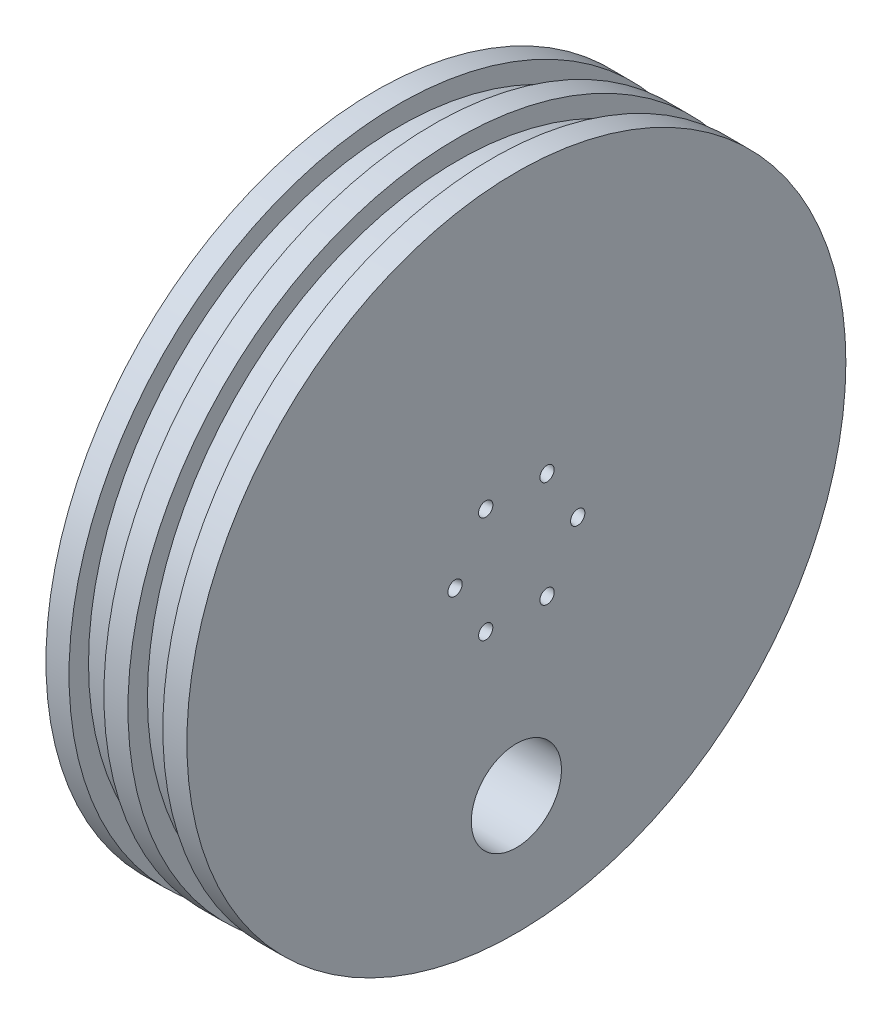
ISO-10303-21;
HEADER;
FILE_DESCRIPTION(('STEP AP214'),'2;1');
FILE_NAME('part.step','',(''),(''),'','','');
FILE_SCHEMA(('AUTOMOTIVE_DESIGN { 1 0 10303 214 1 1 1 1 }'));
ENDSEC;
DATA;
#1=APPLICATION_CONTEXT('core data for automotive mechanical design processes');
#2=APPLICATION_PROTOCOL_DEFINITION('international standard','automotive_design',2000,#1);
#3=PRODUCT_CONTEXT('',#1,'mechanical');
#4=PRODUCT('Part','Part','',(#3));
#5=PRODUCT_RELATED_PRODUCT_CATEGORY('part','',(#4));
#6=PRODUCT_DEFINITION_FORMATION('','',#4);
#7=PRODUCT_DEFINITION_CONTEXT('part definition',#1,'design');
#8=PRODUCT_DEFINITION('design','',#6,#7);
#9=PRODUCT_DEFINITION_SHAPE('','',#8);
#10=(LENGTH_UNIT() NAMED_UNIT(*) SI_UNIT(.MILLI.,.METRE.));
#11=(NAMED_UNIT(*) PLANE_ANGLE_UNIT() SI_UNIT($,.RADIAN.));
#12=(NAMED_UNIT(*) SI_UNIT($,.STERADIAN.) SOLID_ANGLE_UNIT());
#13=UNCERTAINTY_MEASURE_WITH_UNIT(LENGTH_MEASURE(1.E-05),#10,'distance_accuracy_value','');
#14=(GEOMETRIC_REPRESENTATION_CONTEXT(3) GLOBAL_UNCERTAINTY_ASSIGNED_CONTEXT((#13)) GLOBAL_UNIT_ASSIGNED_CONTEXT((#10,
#11,#12)) REPRESENTATION_CONTEXT('',''));
#15=CARTESIAN_POINT('',(0.,0.,0.));
#16=DIRECTION('',(0.,0.,1.));
#17=DIRECTION('',(1.,0.,0.));
#18=AXIS2_PLACEMENT_3D('',#15,#16,#17);
#19=CARTESIAN_POINT('',(-18.06,0.,0.));
#20=DIRECTION('',(-1.,0.,0.));
#21=DIRECTION('',(0.,0.,1.));
#22=AXIS2_PLACEMENT_3D('',#19,#20,#21);
#23=PLANE('',#22);
#24=CARTESIAN_POINT('',(-18.06,-22.225,-1.52655665885959E-13));
#25=DIRECTION('',(-1.,0.,0.));
#26=DIRECTION('',(0.,0.,1.));
#27=AXIS2_PLACEMENT_3D('',#24,#25,#26);
#28=CIRCLE('',#27,4.21639999999999);
#29=CARTESIAN_POINT('',(-18.06,-22.225,4.21639999999984));
#30=VERTEX_POINT('',#29);
#31=EDGE_CURVE('E82',#30,#30,#28,.T.);
#32=ORIENTED_EDGE('',*,*,#31,.F.);
#33=EDGE_LOOP('',(#32));
#34=FACE_BOUND('',#33,.T.);
#35=CARTESIAN_POINT('',(-18.06,11.3347499999999,19.6323628910914));
#36=DIRECTION('',(-1.,0.,0.));
#37=DIRECTION('',(0.,0.,1.));
#38=AXIS2_PLACEMENT_3D('',#35,#36,#37);
#39=CIRCLE('',#38,0.888999999999989);
#40=CARTESIAN_POINT('',(-18.06,11.3347499999999,20.5213628910913));
#41=VERTEX_POINT('',#40);
#42=EDGE_CURVE('E76',#41,#41,#39,.T.);
#43=ORIENTED_EDGE('',*,*,#42,.F.);
#44=EDGE_LOOP('',(#43));
#45=FACE_BOUND('',#44,.T.);
#46=CARTESIAN_POINT('',(-18.06,-7.03945803644227,-5.71569897686727));
#47=DIRECTION('',(-1.,0.,0.));
#48=DIRECTION('',(0.,0.499999999999989,0.866025403784445));
#49=AXIS2_PLACEMENT_3D('',#46,#47,#48);
#50=ELLIPSE('',#49,0.759348844340994,0.749999999999992);
#51=CARTESIAN_POINT('',(-18.06,-6.65978361427178,-5.05808358733361));
#52=VERTEX_POINT('',#51);
#53=EDGE_CURVE('E88',#52,#52,#50,.F.);
#54=ORIENTED_EDGE('',*,*,#53,.T.);
#55=EDGE_LOOP('',(#54));
#56=FACE_BOUND('',#55,.T.);
#57=CARTESIAN_POINT('',(-18.06,-8.4696695325729,3.23849999999995));
#58=DIRECTION('',(-1.,0.,0.));
#59=DIRECTION('',(0.,1.,0.));
#60=AXIS2_PLACEMENT_3D('',#57,#58,#59);
#61=ELLIPSE('',#60,0.759348844340993,0.749999999999991);
#62=CARTESIAN_POINT('',(-18.06,-7.71032068823191,3.23849999999995));
#63=VERTEX_POINT('',#62);
#64=EDGE_CURVE('E92',#63,#63,#61,.F.);
#65=ORIENTED_EDGE('',*,*,#64,.T.);
#66=EDGE_LOOP('',(#65));
#67=FACE_BOUND('',#66,.T.);
#68=CARTESIAN_POINT('',(-18.06,-1.43021149613054,8.95419897686718));
#69=DIRECTION('',(-1.,0.,0.));
#70=DIRECTION('',(0.,0.500000000000001,-0.866025403784438));
#71=AXIS2_PLACEMENT_3D('',#68,#69,#70);
#72=ELLIPSE('',#71,0.759348844340993,0.749999999999991);
#73=CARTESIAN_POINT('',(-18.06,-1.05053707396004,8.29658358733353));
#74=VERTEX_POINT('',#73);
#75=EDGE_CURVE('E96',#74,#74,#72,.F.);
#76=ORIENTED_EDGE('',*,*,#75,.T.);
#77=EDGE_LOOP('',(#76));
#78=FACE_BOUND('',#77,.T.);
#79=CARTESIAN_POINT('',(-18.06,7.03945803644231,5.71569897686722));
#80=DIRECTION('',(-1.,0.,0.));
#81=DIRECTION('',(0.,-0.499999999999995,-0.866025403784442));
#82=AXIS2_PLACEMENT_3D('',#79,#80,#81);
#83=ELLIPSE('',#82,0.759348844340994,0.749999999999992);
#84=CARTESIAN_POINT('',(-18.06,6.65978361427182,5.05808358733356));
#85=VERTEX_POINT('',#84);
#86=EDGE_CURVE('E100',#85,#85,#83,.F.);
#87=ORIENTED_EDGE('',*,*,#86,.T.);
#88=EDGE_LOOP('',(#87));
#89=FACE_BOUND('',#88,.T.);
#90=CARTESIAN_POINT('',(-18.06,8.46966953257289,-3.23849999999999));
#91=DIRECTION('',(-1.,0.,0.));
#92=DIRECTION('',(0.,-1.,0.));
#93=AXIS2_PLACEMENT_3D('',#90,#91,#92);
#94=ELLIPSE('',#93,0.759348844340993,0.749999999999991);
#95=CARTESIAN_POINT('',(-18.06,7.71032068823189,-3.23849999999999));
#96=VERTEX_POINT('',#95);
#97=EDGE_CURVE('E104',#96,#96,#94,.F.);
#98=ORIENTED_EDGE('',*,*,#97,.T.);
#99=EDGE_LOOP('',(#98));
#100=FACE_BOUND('',#99,.T.);
#101=CARTESIAN_POINT('',(-18.06,0.,0.));
#102=DIRECTION('',(1.,0.,0.));
#103=DIRECTION('',(0.,0.,-1.));
#104=AXIS2_PLACEMENT_3D('',#101,#102,#103);
#105=CIRCLE('',#104,29.1592);
#106=CARTESIAN_POINT('',(-18.06,0.,-29.1592));
#107=VERTEX_POINT('',#106);
#108=EDGE_CURVE('E48',#107,#107,#105,.T.);
#109=ORIENTED_EDGE('',*,*,#108,.F.);
#110=EDGE_LOOP('',(#109));
#111=FACE_BOUND('',#110,.T.);
#112=CARTESIAN_POINT('',(-18.06,0.,0.));
#113=DIRECTION('',(1.,0.,0.));
#114=DIRECTION('',(0.,0.,-1.));
#115=AXIS2_PLACEMENT_3D('',#112,#113,#114);
#116=CIRCLE('',#115,4.7625);
#117=CARTESIAN_POINT('',(-18.06,0.,-4.7625));
#118=VERTEX_POINT('',#117);
#119=EDGE_CURVE('E167',#118,#118,#116,.T.);
#120=ORIENTED_EDGE('',*,*,#119,.T.);
#121=EDGE_LOOP('',(#120));
#122=FACE_BOUND('',#121,.T.);
#123=CARTESIAN_POINT('',(-18.06,22.225,0.));
#124=DIRECTION('',(-1.,0.,0.));
#125=DIRECTION('',(0.,0.,1.));
#126=AXIS2_PLACEMENT_3D('',#123,#124,#125);
#127=CIRCLE('',#126,2.0447);
#128=CARTESIAN_POINT('',(-18.06,22.225,2.0447));
#129=VERTEX_POINT('',#128);
#130=EDGE_CURVE('E128',#129,#129,#127,.T.);
#131=ORIENTED_EDGE('',*,*,#130,.F.);
#132=EDGE_LOOP('',(#131));
#133=FACE_BOUND('',#132,.T.);
#134=CARTESIAN_POINT('',(-18.06,-11.1125000000001,19.2474145991091));
#135=DIRECTION('',(-1.,0.,0.));
#136=DIRECTION('',(0.,0.,1.));
#137=AXIS2_PLACEMENT_3D('',#134,#135,#136);
#138=CIRCLE('',#137,2.0447);
#139=CARTESIAN_POINT('',(-18.06,-11.1125000000001,21.2921145991091));
#140=VERTEX_POINT('',#139);
#141=EDGE_CURVE('E122',#140,#140,#138,.T.);
#142=ORIENTED_EDGE('',*,*,#141,.F.);
#143=EDGE_LOOP('',(#142));
#144=FACE_BOUND('',#143,.T.);
#145=CARTESIAN_POINT('',(-18.06,-11.1124999999998,-19.2474145991092));
#146=DIRECTION('',(-1.,0.,0.));
#147=DIRECTION('',(0.,0.,1.));
#148=AXIS2_PLACEMENT_3D('',#145,#146,#147);
#149=CIRCLE('',#148,2.0447);
#150=CARTESIAN_POINT('',(-18.06,-11.1124999999998,-17.2027145991092));
#151=VERTEX_POINT('',#150);
#152=EDGE_CURVE('E116',#151,#151,#149,.T.);
#153=ORIENTED_EDGE('',*,*,#152,.F.);
#154=EDGE_LOOP('',(#153));
#155=FACE_BOUND('',#154,.T.);
#156=CARTESIAN_POINT('',(-18.06,1.43021149613054,-8.95419897686718));
#157=DIRECTION('',(-1.,0.,0.));
#158=DIRECTION('',(0.,-0.500000000000001,0.866025403784438));
#159=AXIS2_PLACEMENT_3D('',#156,#157,#158);
#160=ELLIPSE('',#159,0.759348844340993,0.749999999999991);
#161=CARTESIAN_POINT('',(-18.06,1.05053707396004,-8.29658358733353));
#162=VERTEX_POINT('',#161);
#163=EDGE_CURVE('E110',#162,#162,#160,.F.);
#164=ORIENTED_EDGE('',*,*,#163,.T.);
#165=EDGE_LOOP('',(#164));
#166=FACE_BOUND('',#165,.T.);
#167=ADVANCED_FACE('F39',(#34,#45,#56,#67,#78,#89,#100,#111,#122,#133,#144,#155,#166),#23,.T.);
#168=CARTESIAN_POINT('',(-14.885,0.,0.));
#169=DIRECTION('',(-1.,0.,0.));
#170=DIRECTION('',(0.,0.,1.));
#171=AXIS2_PLACEMENT_3D('',#168,#169,#170);
#172=PLANE('',#171);
#173=CARTESIAN_POINT('',(-14.885,0.,0.));
#174=DIRECTION('',(1.,0.,0.));
#175=DIRECTION('',(0.,0.,-1.));
#176=AXIS2_PLACEMENT_3D('',#173,#174,#175);
#177=CIRCLE('',#176,29.1592);
#178=CARTESIAN_POINT('',(-14.885,0.,-29.1592));
#179=VERTEX_POINT('',#178);
#180=EDGE_CURVE('E11',#179,#179,#177,.T.);
#181=ORIENTED_EDGE('',*,*,#180,.T.);
#182=EDGE_LOOP('',(#181));
#183=FACE_BOUND('',#182,.T.);
#184=CARTESIAN_POINT('',(-14.885,0.,0.));
#185=DIRECTION('',(1.,0.,0.));
#186=DIRECTION('',(0.,0.,-1.));
#187=AXIS2_PLACEMENT_3D('',#184,#185,#186);
#188=CIRCLE('',#187,34.798);
#189=CARTESIAN_POINT('',(-14.885,0.,-34.798));
#190=VERTEX_POINT('',#189);
#191=EDGE_CURVE('E134',#190,#190,#188,.T.);
#192=ORIENTED_EDGE('',*,*,#191,.F.);
#193=EDGE_LOOP('',(#192));
#194=FACE_BOUND('',#193,.T.);
#195=ADVANCED_FACE('F41',(#183,#194),#172,.T.);
#196=CARTESIAN_POINT('',(17.7798798469095,0.,0.));
#197=DIRECTION('',(1.,0.,0.));
#198=DIRECTION('',(0.,0.,-1.));
#199=AXIS2_PLACEMENT_3D('',#196,#197,#198);
#200=CYLINDRICAL_SURFACE('',#199,29.1592);
#201=ORIENTED_EDGE('',*,*,#108,.T.);
#202=EDGE_LOOP('',(#201));
#203=FACE_BOUND('',#202,.T.);
#204=ORIENTED_EDGE('',*,*,#180,.F.);
#205=EDGE_LOOP('',(#204));
#206=FACE_BOUND('',#205,.T.);
#207=ADVANCED_FACE('F218',(#203,#206),#200,.T.);
#208=CARTESIAN_POINT('',(17.7798798469095,0.,0.));
#209=DIRECTION('',(1.,0.,0.));
#210=DIRECTION('',(0.,0.,-1.));
#211=AXIS2_PLACEMENT_3D('',#208,#209,#210);
#212=CYLINDRICAL_SURFACE('',#211,4.7625);
#213=CARTESIAN_POINT('',(-12.599,0.,0.));
#214=DIRECTION('',(1.,0.,0.));
#215=DIRECTION('',(0.,0.,-1.));
#216=AXIS2_PLACEMENT_3D('',#213,#214,#215);
#217=CIRCLE('',#216,4.7625);
#218=CARTESIAN_POINT('',(-12.599,0.,-4.7625));
#219=VERTEX_POINT('',#218);
#220=EDGE_CURVE('E164',#219,#219,#217,.T.);
#221=ORIENTED_EDGE('',*,*,#220,.T.);
#222=EDGE_LOOP('',(#221));
#223=FACE_BOUND('',#222,.T.);
#224=ORIENTED_EDGE('',*,*,#119,.F.);
#225=EDGE_LOOP('',(#224));
#226=FACE_BOUND('',#225,.T.);
#227=ADVANCED_FACE('F223',(#223,#226),#212,.F.);
#228=CARTESIAN_POINT('',(-12.599,0.,0.));
#229=DIRECTION('',(-1.,0.,0.));
#230=DIRECTION('',(0.,0.,1.));
#231=AXIS2_PLACEMENT_3D('',#228,#229,#230);
#232=PLANE('',#231);
#233=CARTESIAN_POINT('',(-12.599,0.,0.));
#234=DIRECTION('',(-1.,0.,0.));
#235=DIRECTION('',(0.,0.,1.));
#236=AXIS2_PLACEMENT_3D('',#233,#234,#235);
#237=CIRCLE('',#236,1.7272);
#238=CARTESIAN_POINT('',(-12.599,0.,1.7272));
#239=VERTEX_POINT('',#238);
#240=EDGE_CURVE('E75',#239,#239,#237,.T.);
#241=ORIENTED_EDGE('',*,*,#240,.F.);
#242=EDGE_LOOP('',(#241));
#243=FACE_BOUND('',#242,.T.);
#244=ORIENTED_EDGE('',*,*,#220,.F.);
#245=EDGE_LOOP('',(#244));
#246=FACE_BOUND('',#245,.T.);
#247=ADVANCED_FACE('F187',(#243,#246),#232,.T.);
#248=CARTESIAN_POINT('',(0.,0.,0.));
#249=DIRECTION('',(1.,0.,0.));
#250=DIRECTION('',(0.,0.,-1.));
#251=AXIS2_PLACEMENT_3D('',#248,#249,#250);
#252=PLANE('',#251);
#253=CARTESIAN_POINT('',(0.,-22.225,-1.52655665885959E-13));
#254=DIRECTION('',(1.,0.,0.));
#255=DIRECTION('',(0.,0.,-1.));
#256=AXIS2_PLACEMENT_3D('',#253,#254,#255);
#257=CIRCLE('',#256,4.7625);
#258=CARTESIAN_POINT('',(0.,-22.225,-4.76250000000015));
#259=VERTEX_POINT('',#258);
#260=EDGE_CURVE('E354',#259,#259,#257,.T.);
#261=ORIENTED_EDGE('',*,*,#260,.F.);
#262=EDGE_LOOP('',(#261));
#263=FACE_BOUND('',#262,.T.);
#264=CARTESIAN_POINT('',(0.,-5.60924654031177,-3.23850000000006));
#265=DIRECTION('',(1.,0.,0.));
#266=DIRECTION('',(0.,0.499999999999989,0.866025403784445));
#267=AXIS2_PLACEMENT_3D('',#264,#265,#266);
#268=ELLIPSE('',#267,0.759348844340994,0.749999999999992);
#269=CARTESIAN_POINT('',(0.,-5.22957211814128,-2.5808846104664));
#270=VERTEX_POINT('',#269);
#271=EDGE_CURVE('E91',#270,#270,#268,.T.);
#272=ORIENTED_EDGE('',*,*,#271,.F.);
#273=EDGE_LOOP('',(#272));
#274=FACE_BOUND('',#273,.T.);
#275=CARTESIAN_POINT('',(0.,-5.60924654031184,3.23849999999995));
#276=DIRECTION('',(1.,0.,0.));
#277=DIRECTION('',(0.,1.,0.));
#278=AXIS2_PLACEMENT_3D('',#275,#276,#277);
#279=ELLIPSE('',#278,0.759348844340993,0.749999999999991);
#280=CARTESIAN_POINT('',(0.,-4.84989769597084,3.23849999999995));
#281=VERTEX_POINT('',#280);
#282=EDGE_CURVE('E95',#281,#281,#279,.T.);
#283=ORIENTED_EDGE('',*,*,#282,.F.);
#284=EDGE_LOOP('',(#283));
#285=FACE_BOUND('',#284,.T.);
#286=CARTESIAN_POINT('',(0.,0.,6.477));
#287=DIRECTION('',(1.,0.,0.));
#288=DIRECTION('',(0.,0.500000000000001,-0.866025403784438));
#289=AXIS2_PLACEMENT_3D('',#286,#287,#288);
#290=ELLIPSE('',#289,0.759348844340993,0.749999999999991);
#291=CARTESIAN_POINT('',(0.,0.379674422170497,5.81938461046634));
#292=VERTEX_POINT('',#291);
#293=EDGE_CURVE('E99',#292,#292,#290,.T.);
#294=ORIENTED_EDGE('',*,*,#293,.F.);
#295=EDGE_LOOP('',(#294));
#296=FACE_BOUND('',#295,.T.);
#297=CARTESIAN_POINT('',(0.,5.60924654031179,3.23850000000003));
#298=DIRECTION('',(1.,0.,0.));
#299=DIRECTION('',(0.,-0.499999999999995,-0.866025403784442));
#300=AXIS2_PLACEMENT_3D('',#297,#298,#299);
#301=ELLIPSE('',#300,0.759348844340994,0.749999999999992);
#302=CARTESIAN_POINT('',(0.,5.2295721181413,2.58088461046637));
#303=VERTEX_POINT('',#302);
#304=EDGE_CURVE('E103',#303,#303,#301,.T.);
#305=ORIENTED_EDGE('',*,*,#304,.F.);
#306=EDGE_LOOP('',(#305));
#307=FACE_BOUND('',#306,.T.);
#308=CARTESIAN_POINT('',(0.,5.60924654031182,-3.23849999999999));
#309=DIRECTION('',(1.,0.,0.));
#310=DIRECTION('',(0.,-1.,0.));
#311=AXIS2_PLACEMENT_3D('',#308,#309,#310);
#312=ELLIPSE('',#311,0.759348844340993,0.749999999999991);
#313=CARTESIAN_POINT('',(0.,4.84989769597082,-3.23849999999999));
#314=VERTEX_POINT('',#313);
#315=EDGE_CURVE('E107',#314,#314,#312,.T.);
#316=ORIENTED_EDGE('',*,*,#315,.F.);
#317=EDGE_LOOP('',(#316));
#318=FACE_BOUND('',#317,.T.);
#319=CARTESIAN_POINT('',(0.,0.,-6.477));
#320=DIRECTION('',(1.,0.,0.));
#321=DIRECTION('',(0.,-0.500000000000001,0.866025403784438));
#322=AXIS2_PLACEMENT_3D('',#319,#320,#321);
#323=ELLIPSE('',#322,0.759348844340993,0.749999999999991);
#324=CARTESIAN_POINT('',(0.,-0.379674422170497,-5.81938461046634));
#325=VERTEX_POINT('',#324);
#326=EDGE_CURVE('E113',#325,#325,#323,.T.);
#327=ORIENTED_EDGE('',*,*,#326,.F.);
#328=EDGE_LOOP('',(#327));
#329=FACE_BOUND('',#328,.T.);
#330=CARTESIAN_POINT('',(0.,0.,0.));
#331=DIRECTION('',(1.,0.,0.));
#332=DIRECTION('',(0.,0.,-1.));
#333=AXIS2_PLACEMENT_3D('',#330,#331,#332);
#334=CIRCLE('',#333,34.798);
#335=CARTESIAN_POINT('',(0.,0.,-34.798));
#336=VERTEX_POINT('',#335);
#337=EDGE_CURVE('E161',#336,#336,#334,.T.);
#338=ORIENTED_EDGE('',*,*,#337,.T.);
#339=EDGE_LOOP('',(#338));
#340=FACE_BOUND('',#339,.T.);
#341=ADVANCED_FACE('F183',(#263,#274,#285,#296,#307,#318,#329,#340),#252,.T.);
#342=CARTESIAN_POINT('',(17.7798798469095,0.,0.));
#343=DIRECTION('',(1.,0.,0.));
#344=DIRECTION('',(0.,0.,-1.));
#345=AXIS2_PLACEMENT_3D('',#342,#343,#344);
#346=CYLINDRICAL_SURFACE('',#345,34.798);
#347=CARTESIAN_POINT('',(-2.54,0.,0.));
#348=DIRECTION('',(1.,0.,0.));
#349=DIRECTION('',(0.,0.,-1.));
#350=AXIS2_PLACEMENT_3D('',#347,#348,#349);
#351=CIRCLE('',#350,34.798);
#352=CARTESIAN_POINT('',(-2.54,0.,-34.798));
#353=VERTEX_POINT('',#352);
#354=EDGE_CURVE('E158',#353,#353,#351,.T.);
#355=ORIENTED_EDGE('',*,*,#354,.T.);
#356=EDGE_LOOP('',(#355));
#357=FACE_BOUND('',#356,.T.);
#358=ORIENTED_EDGE('',*,*,#337,.F.);
#359=EDGE_LOOP('',(#358));
#360=FACE_BOUND('',#359,.T.);
#361=ADVANCED_FACE('F186',(#357,#360),#346,.T.);
#362=CARTESIAN_POINT('',(-2.54,0.,0.));
#363=DIRECTION('',(-1.,0.,0.));
#364=DIRECTION('',(0.,0.,1.));
#365=AXIS2_PLACEMENT_3D('',#362,#363,#364);
#366=PLANE('',#365);
#367=CARTESIAN_POINT('',(-2.53999999999999,0.,0.));
#368=DIRECTION('',(1.,0.,0.));
#369=DIRECTION('',(0.,0.,-1.));
#370=AXIS2_PLACEMENT_3D('',#367,#368,#369);
#371=CIRCLE('',#370,32.7406);
#372=CARTESIAN_POINT('',(-2.53999999999999,0.,-32.7406));
#373=VERTEX_POINT('',#372);
#374=EDGE_CURVE('E155',#373,#373,#371,.T.);
#375=ORIENTED_EDGE('',*,*,#374,.T.);
#376=EDGE_LOOP('',(#375));
#377=FACE_BOUND('',#376,.T.);
#378=ORIENTED_EDGE('',*,*,#354,.F.);
#379=EDGE_LOOP('',(#378));
#380=FACE_BOUND('',#379,.T.);
#381=ADVANCED_FACE('F203',(#377,#380),#366,.T.);
#382=CARTESIAN_POINT('',(17.7798798469095,0.,0.));
#383=DIRECTION('',(1.,0.,0.));
#384=DIRECTION('',(0.,0.,-1.));
#385=AXIS2_PLACEMENT_3D('',#382,#383,#384);
#386=CYLINDRICAL_SURFACE('',#385,32.7406);
#387=CARTESIAN_POINT('',(-6.223,0.,0.));
#388=DIRECTION('',(1.,0.,0.));
#389=DIRECTION('',(0.,0.,-1.));
#390=AXIS2_PLACEMENT_3D('',#387,#388,#389);
#391=CIRCLE('',#390,32.7406);
#392=CARTESIAN_POINT('',(-6.223,0.,-32.7406));
#393=VERTEX_POINT('',#392);
#394=EDGE_CURVE('E152',#393,#393,#391,.T.);
#395=ORIENTED_EDGE('',*,*,#394,.T.);
#396=EDGE_LOOP('',(#395));
#397=FACE_BOUND('',#396,.T.);
#398=ORIENTED_EDGE('',*,*,#374,.F.);
#399=EDGE_LOOP('',(#398));
#400=FACE_BOUND('',#399,.T.);
#401=ADVANCED_FACE('F209',(#397,#400),#386,.T.);
#402=CARTESIAN_POINT('',(-6.22299999999999,0.,0.));
#403=DIRECTION('',(1.,0.,0.));
#404=DIRECTION('',(0.,0.,-1.));
#405=AXIS2_PLACEMENT_3D('',#402,#403,#404);
#406=PLANE('',#405);
#407=CARTESIAN_POINT('',(-6.22299999999999,0.,0.));
#408=DIRECTION('',(1.,0.,0.));
#409=DIRECTION('',(0.,0.,-1.));
#410=AXIS2_PLACEMENT_3D('',#407,#408,#409);
#411=CIRCLE('',#410,34.798);
#412=CARTESIAN_POINT('',(-6.22299999999999,0.,-34.798));
#413=VERTEX_POINT('',#412);
#414=EDGE_CURVE('E149',#413,#413,#411,.T.);
#415=ORIENTED_EDGE('',*,*,#414,.T.);
#416=EDGE_LOOP('',(#415));
#417=FACE_BOUND('',#416,.T.);
#418=ORIENTED_EDGE('',*,*,#394,.F.);
#419=EDGE_LOOP('',(#418));
#420=FACE_BOUND('',#419,.T.);
#421=ADVANCED_FACE('F265',(#417,#420),#406,.T.);
#422=CARTESIAN_POINT('',(17.7798798469095,0.,0.));
#423=DIRECTION('',(1.,0.,0.));
#424=DIRECTION('',(0.,0.,-1.));
#425=AXIS2_PLACEMENT_3D('',#422,#423,#424);
#426=CYLINDRICAL_SURFACE('',#425,34.798);
#427=CARTESIAN_POINT('',(-8.76299999999999,0.,0.));
#428=DIRECTION('',(1.,0.,0.));
#429=DIRECTION('',(0.,0.,-1.));
#430=AXIS2_PLACEMENT_3D('',#427,#428,#429);
#431=CIRCLE('',#430,34.798);
#432=CARTESIAN_POINT('',(-8.76299999999999,0.,-34.798));
#433=VERTEX_POINT('',#432);
#434=EDGE_CURVE('E146',#433,#433,#431,.T.);
#435=ORIENTED_EDGE('',*,*,#434,.T.);
#436=EDGE_LOOP('',(#435));
#437=FACE_BOUND('',#436,.T.);
#438=ORIENTED_EDGE('',*,*,#414,.F.);
#439=EDGE_LOOP('',(#438));
#440=FACE_BOUND('',#439,.T.);
#441=ADVANCED_FACE('F259',(#437,#440),#426,.T.);
#442=CARTESIAN_POINT('',(-8.76299999999999,0.,0.));
#443=DIRECTION('',(-1.,0.,0.));
#444=DIRECTION('',(0.,0.,1.));
#445=AXIS2_PLACEMENT_3D('',#442,#443,#444);
#446=PLANE('',#445);
#447=CARTESIAN_POINT('',(-8.76299999999999,0.,0.));
#448=DIRECTION('',(1.,0.,0.));
#449=DIRECTION('',(0.,0.,-1.));
#450=AXIS2_PLACEMENT_3D('',#447,#448,#449);
#451=CIRCLE('',#450,32.7406);
#452=CARTESIAN_POINT('',(-8.76299999999999,0.,-32.7406));
#453=VERTEX_POINT('',#452);
#454=EDGE_CURVE('E143',#453,#453,#451,.T.);
#455=ORIENTED_EDGE('',*,*,#454,.T.);
#456=EDGE_LOOP('',(#455));
#457=FACE_BOUND('',#456,.T.);
#458=ORIENTED_EDGE('',*,*,#434,.F.);
#459=EDGE_LOOP('',(#458));
#460=FACE_BOUND('',#459,.T.);
#461=ADVANCED_FACE('F253',(#457,#460),#446,.T.);
#462=CARTESIAN_POINT('',(17.7798798469095,0.,0.));
#463=DIRECTION('',(1.,0.,0.));
#464=DIRECTION('',(0.,0.,-1.));
#465=AXIS2_PLACEMENT_3D('',#462,#463,#464);
#466=CYLINDRICAL_SURFACE('',#465,32.7406);
#467=CARTESIAN_POINT('',(-12.446,0.,0.));
#468=DIRECTION('',(1.,0.,0.));
#469=DIRECTION('',(0.,0.,-1.));
#470=AXIS2_PLACEMENT_3D('',#467,#468,#469);
#471=CIRCLE('',#470,32.7406);
#472=CARTESIAN_POINT('',(-12.446,0.,-32.7406));
#473=VERTEX_POINT('',#472);
#474=EDGE_CURVE('E140',#473,#473,#471,.T.);
#475=ORIENTED_EDGE('',*,*,#474,.T.);
#476=EDGE_LOOP('',(#475));
#477=FACE_BOUND('',#476,.T.);
#478=ORIENTED_EDGE('',*,*,#454,.F.);
#479=EDGE_LOOP('',(#478));
#480=FACE_BOUND('',#479,.T.);
#481=ADVANCED_FACE('F247',(#477,#480),#466,.T.);
#482=CARTESIAN_POINT('',(-12.446,0.,0.));
#483=DIRECTION('',(1.,0.,0.));
#484=DIRECTION('',(0.,0.,-1.));
#485=AXIS2_PLACEMENT_3D('',#482,#483,#484);
#486=PLANE('',#485);
#487=CARTESIAN_POINT('',(-12.446,0.,0.));
#488=DIRECTION('',(1.,0.,0.));
#489=DIRECTION('',(0.,0.,-1.));
#490=AXIS2_PLACEMENT_3D('',#487,#488,#489);
#491=CIRCLE('',#490,34.798);
#492=CARTESIAN_POINT('',(-12.446,0.,-34.798));
#493=VERTEX_POINT('',#492);
#494=EDGE_CURVE('E137',#493,#493,#491,.T.);
#495=ORIENTED_EDGE('',*,*,#494,.T.);
#496=EDGE_LOOP('',(#495));
#497=FACE_BOUND('',#496,.T.);
#498=ORIENTED_EDGE('',*,*,#474,.F.);
#499=EDGE_LOOP('',(#498));
#500=FACE_BOUND('',#499,.T.);
#501=ADVANCED_FACE('F241',(#497,#500),#486,.T.);
#502=CARTESIAN_POINT('',(17.7798798469095,0.,0.));
#503=DIRECTION('',(1.,0.,0.));
#504=DIRECTION('',(0.,0.,-1.));
#505=AXIS2_PLACEMENT_3D('',#502,#503,#504);
#506=CYLINDRICAL_SURFACE('',#505,34.798);
#507=ORIENTED_EDGE('',*,*,#191,.T.);
#508=EDGE_LOOP('',(#507));
#509=FACE_BOUND('',#508,.T.);
#510=ORIENTED_EDGE('',*,*,#494,.F.);
#511=EDGE_LOOP('',(#510));
#512=FACE_BOUND('',#511,.T.);
#513=ADVANCED_FACE('F237',(#509,#512),#506,.T.);
#514=CARTESIAN_POINT('',(-8.408,22.225,0.));
#515=DIRECTION('',(-1.,0.,0.));
#516=DIRECTION('',(0.,0.,1.));
#517=AXIS2_PLACEMENT_3D('',#514,#515,#516);
#518=CONICAL_SURFACE('',#517,2.0447,1.02974425867665);
#519=CARTESIAN_POINT('',(-7.17942029227434,22.225,0.));
#520=VERTEX_POINT('',#519);
#521=VERTEX_LOOP('',#520);
#522=FACE_BOUND('',#521,.T.);
#523=CARTESIAN_POINT('',(-8.408,22.225,0.));
#524=DIRECTION('',(-1.,0.,0.));
#525=DIRECTION('',(0.,0.,1.));
#526=AXIS2_PLACEMENT_3D('',#523,#524,#525);
#527=CIRCLE('',#526,2.0447);
#528=CARTESIAN_POINT('',(-8.408,22.225,2.0447));
#529=VERTEX_POINT('',#528);
#530=EDGE_CURVE('E131',#529,#529,#527,.T.);
#531=ORIENTED_EDGE('',*,*,#530,.T.);
#532=EDGE_LOOP('',(#531));
#533=FACE_BOUND('',#532,.T.);
#534=ADVANCED_FACE('F240',(#522,#533),#518,.F.);
#535=CARTESIAN_POINT('',(-18.06,22.225,0.));
#536=DIRECTION('',(-1.,0.,0.));
#537=DIRECTION('',(0.,0.,1.));
#538=AXIS2_PLACEMENT_3D('',#535,#536,#537);
#539=CYLINDRICAL_SURFACE('',#538,2.0447);
#540=ORIENTED_EDGE('',*,*,#530,.F.);
#541=EDGE_LOOP('',(#540));
#542=FACE_BOUND('',#541,.T.);
#543=ORIENTED_EDGE('',*,*,#130,.T.);
#544=EDGE_LOOP('',(#543));
#545=FACE_BOUND('',#544,.T.);
#546=ADVANCED_FACE('F285',(#542,#545),#539,.F.);
#547=CARTESIAN_POINT('',(-8.408,-11.1125000000001,19.2474145991091));
#548=DIRECTION('',(-1.,0.,0.));
#549=DIRECTION('',(0.,0.,1.));
#550=AXIS2_PLACEMENT_3D('',#547,#548,#549);
#551=CONICAL_SURFACE('',#550,2.0447,1.02974425867665);
#552=CARTESIAN_POINT('',(-7.17942029227434,-11.1125000000001,19.2474145991091));
#553=VERTEX_POINT('',#552);
#554=VERTEX_LOOP('',#553);
#555=FACE_BOUND('',#554,.T.);
#556=CARTESIAN_POINT('',(-8.408,-11.1125000000001,19.2474145991091));
#557=DIRECTION('',(-1.,0.,0.));
#558=DIRECTION('',(0.,0.,1.));
#559=AXIS2_PLACEMENT_3D('',#556,#557,#558);
#560=CIRCLE('',#559,2.0447);
#561=CARTESIAN_POINT('',(-8.408,-11.1125000000001,21.2921145991091));
#562=VERTEX_POINT('',#561);
#563=EDGE_CURVE('E125',#562,#562,#560,.T.);
#564=ORIENTED_EDGE('',*,*,#563,.T.);
#565=EDGE_LOOP('',(#564));
#566=FACE_BOUND('',#565,.T.);
#567=ADVANCED_FACE('F288',(#555,#566),#551,.F.);
#568=CARTESIAN_POINT('',(-18.06,-11.1125000000001,19.2474145991091));
#569=DIRECTION('',(-1.,0.,0.));
#570=DIRECTION('',(0.,0.,1.));
#571=AXIS2_PLACEMENT_3D('',#568,#569,#570);
#572=CYLINDRICAL_SURFACE('',#571,2.0447);
#573=ORIENTED_EDGE('',*,*,#563,.F.);
#574=EDGE_LOOP('',(#573));
#575=FACE_BOUND('',#574,.T.);
#576=ORIENTED_EDGE('',*,*,#141,.T.);
#577=EDGE_LOOP('',(#576));
#578=FACE_BOUND('',#577,.T.);
#579=ADVANCED_FACE('F292',(#575,#578),#572,.F.);
#580=CARTESIAN_POINT('',(-8.408,-11.1124999999998,-19.2474145991092));
#581=DIRECTION('',(-1.,0.,0.));
#582=DIRECTION('',(0.,0.,1.));
#583=AXIS2_PLACEMENT_3D('',#580,#581,#582);
#584=CONICAL_SURFACE('',#583,2.0447,1.02974425867665);
#585=CARTESIAN_POINT('',(-7.17942029227434,-11.1124999999998,-19.2474145991092));
#586=VERTEX_POINT('',#585);
#587=VERTEX_LOOP('',#586);
#588=FACE_BOUND('',#587,.T.);
#589=CARTESIAN_POINT('',(-8.408,-11.1124999999998,-19.2474145991092));
#590=DIRECTION('',(-1.,0.,0.));
#591=DIRECTION('',(0.,0.,1.));
#592=AXIS2_PLACEMENT_3D('',#589,#590,#591);
#593=CIRCLE('',#592,2.0447);
#594=CARTESIAN_POINT('',(-8.408,-11.1124999999998,-17.2027145991092));
#595=VERTEX_POINT('',#594);
#596=EDGE_CURVE('E119',#595,#595,#593,.T.);
#597=ORIENTED_EDGE('',*,*,#596,.T.);
#598=EDGE_LOOP('',(#597));
#599=FACE_BOUND('',#598,.T.);
#600=ADVANCED_FACE('F295',(#588,#599),#584,.F.);
#601=CARTESIAN_POINT('',(-18.06,-11.1124999999998,-19.2474145991092));
#602=DIRECTION('',(-1.,0.,0.));
#603=DIRECTION('',(0.,0.,1.));
#604=AXIS2_PLACEMENT_3D('',#601,#602,#603);
#605=CYLINDRICAL_SURFACE('',#604,2.0447);
#606=ORIENTED_EDGE('',*,*,#596,.F.);
#607=EDGE_LOOP('',(#606));
#608=FACE_BOUND('',#607,.T.);
#609=ORIENTED_EDGE('',*,*,#152,.T.);
#610=EDGE_LOOP('',(#609));
#611=FACE_BOUND('',#610,.T.);
#612=ADVANCED_FACE('F299',(#608,#611),#605,.F.);
#613=CARTESIAN_POINT('',(0.866676253297597,-0.0686340166605516,-6.35812239601639));
#614=DIRECTION('',(0.987688340595138,-0.0782172325201141,0.135476220752266));
#615=DIRECTION('',(0.135892549420801,0.,-0.9907235815362));
#616=AXIS2_PLACEMENT_3D('',#613,#614,#615);
#617=CYLINDRICAL_SURFACE('',#616,0.749999999999991);
#618=ORIENTED_EDGE('',*,*,#326,.T.);
#619=EDGE_LOOP('',(#618));
#620=FACE_BOUND('',#619,.T.);
#621=ORIENTED_EDGE('',*,*,#163,.F.);
#622=EDGE_LOOP('',(#621));
#623=FACE_BOUND('',#622,.T.);
#624=ADVANCED_FACE('F303',(#620,#623),#617,.F.);
#625=CARTESIAN_POINT('',(0.866676253297597,5.47197850699071,-3.23849999999999));
#626=DIRECTION('',(0.987688340595138,-0.156434465040228,0.));
#627=DIRECTION('',(0.156434465040228,0.987688340595138,0.));
#628=AXIS2_PLACEMENT_3D('',#625,#626,#627);
#629=CYLINDRICAL_SURFACE('',#628,0.749999999999991);
#630=ORIENTED_EDGE('',*,*,#315,.T.);
#631=EDGE_LOOP('',(#630));
#632=FACE_BOUND('',#631,.T.);
#633=ORIENTED_EDGE('',*,*,#97,.F.);
#634=EDGE_LOOP('',(#633));
#635=FACE_BOUND('',#634,.T.);
#636=ADVANCED_FACE('F307',(#632,#635),#629,.F.);
#637=CARTESIAN_POINT('',(0.866676253297597,5.54061252365124,3.11962239601642));
#638=DIRECTION('',(0.987688340595138,-0.0782172325201131,-0.135476220752266));
#639=DIRECTION('',(-0.135892549420801,0.,-0.9907235815362));
#640=AXIS2_PLACEMENT_3D('',#637,#638,#639);
#641=CYLINDRICAL_SURFACE('',#640,0.749999999999992);
#642=ORIENTED_EDGE('',*,*,#304,.T.);
#643=EDGE_LOOP('',(#642));
#644=FACE_BOUND('',#643,.T.);
#645=ORIENTED_EDGE('',*,*,#86,.F.);
#646=EDGE_LOOP('',(#645));
#647=FACE_BOUND('',#646,.T.);
#648=ADVANCED_FACE('F311',(#644,#647),#641,.F.);
#649=CARTESIAN_POINT('',(0.866676253297597,0.0686340166605516,6.35812239601639));
#650=DIRECTION('',(0.987688340595138,0.0782172325201141,-0.135476220752266));
#651=DIRECTION('',(-0.135892549420801,0.,-0.9907235815362));
#652=AXIS2_PLACEMENT_3D('',#649,#650,#651);
#653=CYLINDRICAL_SURFACE('',#652,0.749999999999991);
#654=ORIENTED_EDGE('',*,*,#293,.T.);
#655=EDGE_LOOP('',(#654));
#656=FACE_BOUND('',#655,.T.);
#657=ORIENTED_EDGE('',*,*,#75,.F.);
#658=EDGE_LOOP('',(#657));
#659=FACE_BOUND('',#658,.T.);
#660=ADVANCED_FACE('F315',(#656,#659),#653,.F.);
#661=CARTESIAN_POINT('',(0.866676253297597,-5.47197850699073,3.23849999999995));
#662=DIRECTION('',(0.987688340595138,0.156434465040228,0.));
#663=DIRECTION('',(-0.156434465040228,0.987688340595138,0.));
#664=AXIS2_PLACEMENT_3D('',#661,#662,#663);
#665=CYLINDRICAL_SURFACE('',#664,0.749999999999991);
#666=ORIENTED_EDGE('',*,*,#282,.T.);
#667=EDGE_LOOP('',(#666));
#668=FACE_BOUND('',#667,.T.);
#669=ORIENTED_EDGE('',*,*,#64,.F.);
#670=EDGE_LOOP('',(#669));
#671=FACE_BOUND('',#670,.T.);
#672=ADVANCED_FACE('F319',(#668,#671),#665,.F.);
#673=CARTESIAN_POINT('',(0.866676253297597,-5.54061252365122,-3.11962239601646));
#674=DIRECTION('',(0.987688340595138,0.0782172325201122,0.135476220752267));
#675=DIRECTION('',(0.135892549420802,0.,-0.9907235815362));
#676=AXIS2_PLACEMENT_3D('',#673,#674,#675);
#677=CYLINDRICAL_SURFACE('',#676,0.749999999999992);
#678=ORIENTED_EDGE('',*,*,#271,.T.);
#679=EDGE_LOOP('',(#678));
#680=FACE_BOUND('',#679,.T.);
#681=ORIENTED_EDGE('',*,*,#53,.F.);
#682=EDGE_LOOP('',(#681));
#683=FACE_BOUND('',#682,.T.);
#684=ADVANCED_FACE('F180',(#680,#683),#677,.F.);
#685=CARTESIAN_POINT('',(-6.249,0.,0.));
#686=DIRECTION('',(-1.,0.,0.));
#687=DIRECTION('',(0.,0.,1.));
#688=AXIS2_PLACEMENT_3D('',#685,#686,#687);
#689=CONICAL_SURFACE('',#688,1.7272,1.02974425867665);
#690=CARTESIAN_POINT('',(-5.2111935388156,0.,0.));
#691=VERTEX_POINT('',#690);
#692=VERTEX_LOOP('',#691);
#693=FACE_BOUND('',#692,.T.);
#694=CARTESIAN_POINT('',(-6.249,0.,0.));
#695=DIRECTION('',(-1.,0.,0.));
#696=DIRECTION('',(0.,0.,1.));
#697=AXIS2_PLACEMENT_3D('',#694,#695,#696);
#698=CIRCLE('',#697,1.7272);
#699=CARTESIAN_POINT('',(-6.249,0.,1.7272));
#700=VERTEX_POINT('',#699);
#701=EDGE_CURVE('E79',#700,#700,#698,.T.);
#702=ORIENTED_EDGE('',*,*,#701,.T.);
#703=EDGE_LOOP('',(#702));
#704=FACE_BOUND('',#703,.T.);
#705=ADVANCED_FACE('F326',(#693,#704),#689,.F.);
#706=CARTESIAN_POINT('',(-12.599,0.,0.));
#707=DIRECTION('',(-1.,0.,0.));
#708=DIRECTION('',(0.,0.,1.));
#709=AXIS2_PLACEMENT_3D('',#706,#707,#708);
#710=CYLINDRICAL_SURFACE('',#709,1.7272);
#711=ORIENTED_EDGE('',*,*,#701,.F.);
#712=EDGE_LOOP('',(#711));
#713=FACE_BOUND('',#712,.T.);
#714=ORIENTED_EDGE('',*,*,#240,.T.);
#715=EDGE_LOOP('',(#714));
#716=FACE_BOUND('',#715,.T.);
#717=ADVANCED_FACE('F69',(#713,#716),#710,.F.);
#718=CARTESIAN_POINT('',(-6.12199999999999,11.3347499999999,19.6323628910914));
#719=DIRECTION('',(-1.,0.,0.));
#720=DIRECTION('',(0.,0.,1.));
#721=AXIS2_PLACEMENT_3D('',#718,#719,#720);
#722=CONICAL_SURFACE('',#721,0.888999999999987,1.02974425867665);
#723=CARTESIAN_POINT('',(-5.5878349096845,11.3347499999999,19.6323628910914));
#724=VERTEX_POINT('',#723);
#725=VERTEX_LOOP('',#724);
#726=FACE_BOUND('',#725,.T.);
#727=CARTESIAN_POINT('',(-6.12199999999999,11.3347499999999,19.6323628910914));
#728=DIRECTION('',(-1.,0.,0.));
#729=DIRECTION('',(0.,0.,1.));
#730=AXIS2_PLACEMENT_3D('',#727,#728,#729);
#731=CIRCLE('',#730,0.888999999999987);
#732=CARTESIAN_POINT('',(-6.12199999999999,11.3347499999999,20.5213628910913));
#733=VERTEX_POINT('',#732);
#734=EDGE_CURVE('E73',#733,#733,#731,.T.);
#735=ORIENTED_EDGE('',*,*,#734,.T.);
#736=EDGE_LOOP('',(#735));
#737=FACE_BOUND('',#736,.T.);
#738=ADVANCED_FACE('F65',(#726,#737),#722,.F.);
#739=CARTESIAN_POINT('',(-18.06,11.3347499999999,19.6323628910914));
#740=DIRECTION('',(-1.,0.,0.));
#741=DIRECTION('',(0.,0.,1.));
#742=AXIS2_PLACEMENT_3D('',#739,#740,#741);
#743=CYLINDRICAL_SURFACE('',#742,0.888999999999988);
#744=ORIENTED_EDGE('',*,*,#734,.F.);
#745=EDGE_LOOP('',(#744));
#746=FACE_BOUND('',#745,.T.);
#747=ORIENTED_EDGE('',*,*,#42,.T.);
#748=EDGE_LOOP('',(#747));
#749=FACE_BOUND('',#748,.T.);
#750=ADVANCED_FACE('F68',(#746,#749),#743,.F.);
#751=CARTESIAN_POINT('',(-18.06,-22.225,-1.52655665885959E-13));
#752=DIRECTION('',(-1.,0.,0.));
#753=DIRECTION('',(0.,0.,1.));
#754=AXIS2_PLACEMENT_3D('',#751,#752,#753);
#755=CYLINDRICAL_SURFACE('',#754,4.21639999999999);
#756=CARTESIAN_POINT('',(-9.47212998405095,-22.225,-1.52655665885959E-13));
#757=DIRECTION('',(1.,0.,0.));
#758=DIRECTION('',(0.,0.,-1.));
#759=AXIS2_PLACEMENT_3D('',#756,#757,#758);
#760=CIRCLE('',#759,4.21639999999999);
#761=CARTESIAN_POINT('',(-9.47212998405095,-22.225,-4.21640000000015));
#762=VERTEX_POINT('',#761);
#763=EDGE_CURVE('E43',#762,#762,#760,.T.);
#764=ORIENTED_EDGE('',*,*,#763,.T.);
#765=EDGE_LOOP('',(#764));
#766=FACE_BOUND('',#765,.T.);
#767=ORIENTED_EDGE('',*,*,#31,.T.);
#768=EDGE_LOOP('',(#767));
#769=FACE_BOUND('',#768,.T.);
#770=ADVANCED_FACE('F335',(#766,#769),#755,.F.);
#771=CARTESIAN_POINT('',(-9.144,-22.225,-1.52655665885959E-13));
#772=DIRECTION('',(1.,0.,0.));
#773=DIRECTION('',(0.,0.,-1.));
#774=AXIS2_PLACEMENT_3D('',#771,#772,#773);
#775=CONICAL_SURFACE('',#774,4.7625,1.02974425867665);
#776=CARTESIAN_POINT('',(-9.144,-22.225,-1.52655665885959E-13));
#777=DIRECTION('',(1.,0.,0.));
#778=DIRECTION('',(0.,0.,-1.));
#779=AXIS2_PLACEMENT_3D('',#776,#777,#778);
#780=CIRCLE('',#779,4.7625);
#781=CARTESIAN_POINT('',(-9.144,-22.225,-4.76250000000015));
#782=VERTEX_POINT('',#781);
#783=EDGE_CURVE('E351',#782,#782,#780,.T.);
#784=ORIENTED_EDGE('',*,*,#783,.T.);
#785=EDGE_LOOP('',(#784));
#786=FACE_BOUND('',#785,.T.);
#787=ORIENTED_EDGE('',*,*,#763,.F.);
#788=EDGE_LOOP('',(#787));
#789=FACE_BOUND('',#788,.T.);
#790=ADVANCED_FACE('F338',(#786,#789),#775,.F.);
#791=CARTESIAN_POINT('',(0.,-22.225,-1.52655665885959E-13));
#792=DIRECTION('',(1.,0.,0.));
#793=DIRECTION('',(0.,0.,-1.));
#794=AXIS2_PLACEMENT_3D('',#791,#792,#793);
#795=CYLINDRICAL_SURFACE('',#794,4.7625);
#796=ORIENTED_EDGE('',*,*,#783,.F.);
#797=EDGE_LOOP('',(#796));
#798=FACE_BOUND('',#797,.T.);
#799=ORIENTED_EDGE('',*,*,#260,.T.);
#800=EDGE_LOOP('',(#799));
#801=FACE_BOUND('',#800,.T.);
#802=ADVANCED_FACE('F342',(#798,#801),#795,.F.);
#803=CLOSED_SHELL('',(#167,#195,#207,#227,#247,#341,#361,#381,#401,#421,#441,#461,#481,#501,
#513,#534,#546,#567,#579,#600,#612,#624,#636,#648,#660,#672,#684,#705,#717,#738,#750,#770,#790,#802));
#804=MANIFOLD_SOLID_BREP('B2',#803);
#805=ADVANCED_BREP_SHAPE_REPRESENTATION('',(#18,#804),#14);
#806=SHAPE_DEFINITION_REPRESENTATION(#9,#805);
ENDSEC;
END-ISO-10303-21;
